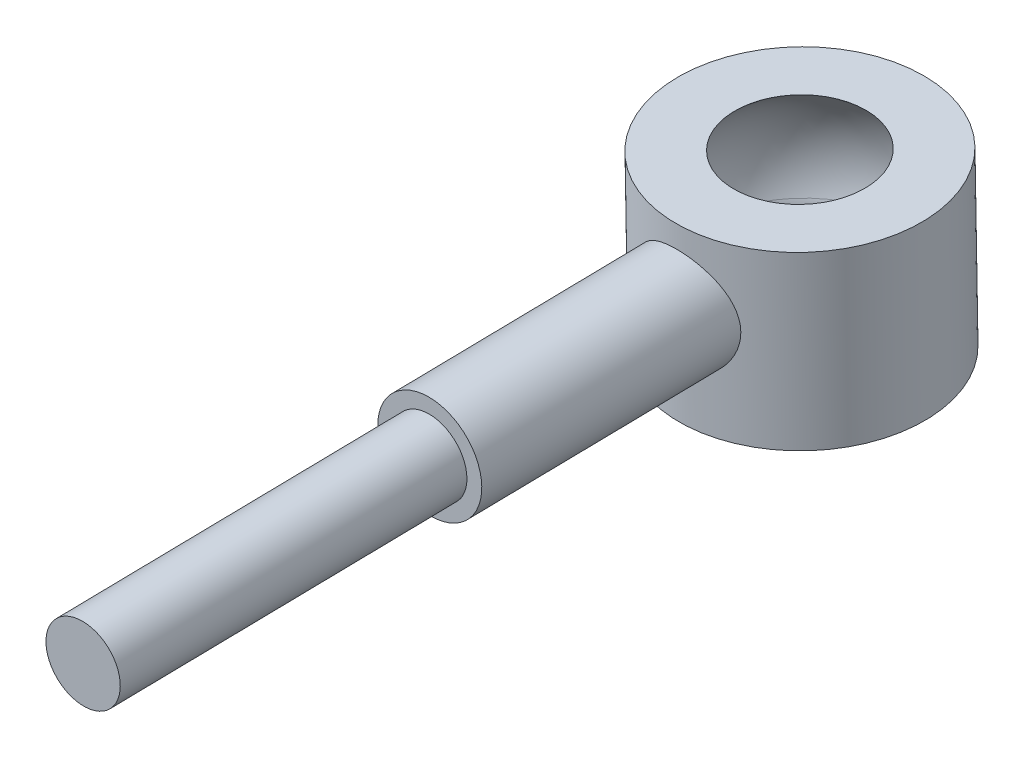
ISO-10303-21;
HEADER;
FILE_DESCRIPTION(('STEP AP214'),'2;1');
FILE_NAME('part.step','',(''),(''),'','','');
FILE_SCHEMA(('AUTOMOTIVE_DESIGN { 1 0 10303 214 1 1 1 1 }'));
ENDSEC;
DATA;
#1=APPLICATION_CONTEXT('core data for automotive mechanical design processes');
#2=APPLICATION_PROTOCOL_DEFINITION('international standard','automotive_design',2000,#1);
#3=PRODUCT_CONTEXT('',#1,'mechanical');
#4=PRODUCT('Part','Part','',(#3));
#5=PRODUCT_RELATED_PRODUCT_CATEGORY('part','',(#4));
#6=PRODUCT_DEFINITION_FORMATION('','',#4);
#7=PRODUCT_DEFINITION_CONTEXT('part definition',#1,'design');
#8=PRODUCT_DEFINITION('design','',#6,#7);
#9=PRODUCT_DEFINITION_SHAPE('','',#8);
#10=(LENGTH_UNIT() NAMED_UNIT(*) SI_UNIT(.MILLI.,.METRE.));
#11=(NAMED_UNIT(*) PLANE_ANGLE_UNIT() SI_UNIT($,.RADIAN.));
#12=(NAMED_UNIT(*) SI_UNIT($,.STERADIAN.) SOLID_ANGLE_UNIT());
#13=UNCERTAINTY_MEASURE_WITH_UNIT(LENGTH_MEASURE(1.E-05),#10,'distance_accuracy_value','');
#14=(GEOMETRIC_REPRESENTATION_CONTEXT(3) GLOBAL_UNCERTAINTY_ASSIGNED_CONTEXT((#13)) GLOBAL_UNIT_ASSIGNED_CONTEXT((#10,
#11,#12)) REPRESENTATION_CONTEXT('',''));
#15=CARTESIAN_POINT('',(0.,0.,0.));
#16=DIRECTION('',(0.,0.,1.));
#17=DIRECTION('',(1.,0.,0.));
#18=AXIS2_PLACEMENT_3D('',#15,#16,#17);
#19=CARTESIAN_POINT('',(111.05852848142,5.49576172046374,-579.851978097171));
#20=DIRECTION('',(0.,-0.0174524064372832,0.999847695156391));
#21=DIRECTION('',(0.,0.999847695156391,0.0174524064372832));
#22=AXIS2_PLACEMENT_3D('',#19,#20,#21);
#23=CYLINDRICAL_SURFACE('',#22,10.5);
#24=CARTESIAN_POINT('',(111.05852848142,4.44861733422675,-519.861116387788));
#25=DIRECTION('',(0.,-0.0174524064372832,0.999847695156391));
#26=DIRECTION('',(0.,-0.999847695156391,-0.0174524064372832));
#27=AXIS2_PLACEMENT_3D('',#24,#25,#26);
#28=CIRCLE('',#27,10.5);
#29=CARTESIAN_POINT('',(111.05852848142,-6.04978346491538,-520.044366655379));
#30=VERTEX_POINT('',#29);
#31=EDGE_CURVE('E99',#30,#30,#28,.T.);
#32=ORIENTED_EDGE('',*,*,#31,.F.);
#33=EDGE_LOOP('',(#32));
#34=FACE_BOUND('',#33,.T.);
#35=CARTESIAN_POINT('',(111.05852848142,15.819638455233,-569.670250878016));
#36=CARTESIAN_POINT('',(110.777384349737,15.8196365393947,-569.670252477631));
#37=CARTESIAN_POINT('',(110.496147895162,15.808416209979,-569.675202925125));
#38=CARTESIAN_POINT('',(109.935679892425,15.7636386044109,-569.694884567285));
#39=CARTESIAN_POINT('',(109.656449709096,15.7300673539752,-569.709621880898));
#40=CARTESIAN_POINT('',(109.101567841366,15.6408351314711,-569.748540625365));
#41=CARTESIAN_POINT('',(108.825925410942,15.5851255885031,-569.772742820081));
#42=CARTESIAN_POINT('',(108.280810988346,15.4521811234063,-569.829971182351));
#43=CARTESIAN_POINT('',(108.011339426624,15.3749447045813,-569.862997963445));
#44=CARTESIAN_POINT('',(107.481317797542,15.1999909110264,-569.936918568452));
#45=CARTESIAN_POINT('',(107.220739724531,15.1023464092781,-569.977784359336));
#46=CARTESIAN_POINT('',(106.709119534087,14.8872600801992,-570.06647167427));
#47=CARTESIAN_POINT('',(106.458077751761,14.7698175579475,-570.114293442471));
#48=CARTESIAN_POINT('',(105.967093157236,14.5161143648105,-570.215750212554));
#49=CARTESIAN_POINT('',(105.727144250639,14.3798641948331,-570.269381966965));
#50=CARTESIAN_POINT('',(105.259436193008,14.0894476275166,-570.381258528314));
#51=CARTESIAN_POINT('',(105.03168155133,13.935274668378,-570.439505022277));
#52=CARTESIAN_POINT('',(104.348132105347,13.4323111898447,-570.624759594036));
#53=CARTESIAN_POINT('',(103.914615371524,13.0546903859141,-570.757461665963));
#54=CARTESIAN_POINT('',(103.115319100255,12.233722432439,-571.024776005919));
#55=CARTESIAN_POINT('',(102.749575760099,11.7903403865673,-571.159389253611));
#56=CARTESIAN_POINT('',(102.250190824283,11.0715158647503,-571.355791524534));
#57=CARTESIAN_POINT('',(102.088741715503,10.8161642882862,-571.421838155697));
#58=CARTESIAN_POINT('',(101.788180951947,10.291471329918,-571.548776402237));
#59=CARTESIAN_POINT('',(101.649060048134,10.0221358021105,-571.609670147132));
#60=CARTESIAN_POINT('',(101.394375039658,9.47116810136559,-571.724405622228));
#61=CARTESIAN_POINT('',(101.278806646677,9.1895381782866,-571.778248635551));
#62=CARTESIAN_POINT('',(101.072361113972,8.6158643908961,-571.877123745303));
#63=CARTESIAN_POINT('',(100.981482102413,8.32382131796232,-571.922156509612));
#64=CARTESIAN_POINT('',(100.829261976067,7.74597564118746,-571.999919027966));
#65=CARTESIAN_POINT('',(100.766698300305,7.46056133533449,-572.033140982626));
#66=CARTESIAN_POINT('',(100.665589241805,6.88449236160432,-572.089146933261));
#67=CARTESIAN_POINT('',(100.627043106271,6.59383785826754,-572.111931256384));
#68=CARTESIAN_POINT('',(100.574464682201,6.00980316186041,-572.14634363168));
#69=CARTESIAN_POINT('',(100.560420517147,5.7164243586726,-572.157977087633));
#70=CARTESIAN_POINT('',(100.556994174233,5.12930009420325,-572.16981101239));
#71=CARTESIAN_POINT('',(100.567610666605,4.83555465354542,-572.170012097643));
#72=CARTESIAN_POINT('',(100.611563419944,4.27317901768693,-572.159560340829));
#73=CARTESIAN_POINT('',(100.643052357713,4.00438603169379,-572.149757582794));
#74=CARTESIAN_POINT('',(100.726523779092,3.47040472182273,-572.121003961527));
#75=CARTESIAN_POINT('',(100.7785133018,3.20521766846911,-572.102049955612));
#76=CARTESIAN_POINT('',(100.902445735054,2.6803805620533,-572.055701614354));
#77=CARTESIAN_POINT('',(100.97438392187,2.42072921382321,-572.02830927699));
#78=CARTESIAN_POINT('',(101.137584215436,1.90840064050501,-571.965993394065));
#79=CARTESIAN_POINT('',(101.228853900353,1.65572619447879,-571.931066894928));
#80=CARTESIAN_POINT('',(101.432053722828,1.15367226509898,-571.853971863579));
#81=CARTESIAN_POINT('',(101.544377121135,0.904473108980535,-571.811666774409));
#82=CARTESIAN_POINT('',(101.787551394306,0.416190425280532,-571.721591428782));
#83=CARTESIAN_POINT('',(101.918410279259,0.177111329394334,-571.673818811262));
#84=CARTESIAN_POINT('',(102.197753230039,-0.289642505858961,-571.57415314088));
#85=CARTESIAN_POINT('',(102.346239087278,-0.517316082745503,-571.522259669399));
#86=CARTESIAN_POINT('',(102.659945805205,-0.960150092803522,-571.415717524804));
#87=CARTESIAN_POINT('',(102.825167619496,-1.17530981184291,-571.361068694782));
#88=CARTESIAN_POINT('',(103.186408660403,-1.61007893108151,-571.2456021489));
#89=CARTESIAN_POINT('',(103.383855095365,-1.82847114620613,-571.184658940952));
#90=CARTESIAN_POINT('',(103.796233704648,-2.24795223053627,-571.062873569444));
#91=CARTESIAN_POINT('',(104.011160363289,-2.44904651700627,-571.002031380144));
#92=CARTESIAN_POINT('',(104.457506554177,-2.83290330824388,-570.882063530896));
#93=CARTESIAN_POINT('',(104.688936392288,-3.01565418342086,-570.822938976581));
#94=CARTESIAN_POINT('',(105.16678357006,-3.36137142207475,-570.70808472573));
#95=CARTESIAN_POINT('',(105.413194839828,-3.52434571912127,-570.652353672359));
#96=CARTESIAN_POINT('',(105.925780177558,-3.83304289555376,-570.544504310611));
#97=CARTESIAN_POINT('',(106.192287428552,-3.97825530224047,-570.492505452701));
#98=CARTESIAN_POINT('',(106.737901533604,-4.24543133981205,-570.395167972121));
#99=CARTESIAN_POINT('',(107.017008718549,-4.36739435970466,-570.349829524494));
#100=CARTESIAN_POINT('',(107.585720387102,-4.58679374757015,-570.267196364429));
#101=CARTESIAN_POINT('',(107.875320043576,-4.68424123420838,-570.229898006628));
#102=CARTESIAN_POINT('',(108.462902201433,-4.85359224092613,-570.164475965236));
#103=CARTESIAN_POINT('',(108.760884052503,-4.92549773675805,-570.136351572026));
#104=CARTESIAN_POINT('',(109.343476669837,-5.03914282494592,-570.091647519976));
#105=CARTESIAN_POINT('',(109.627720932085,-5.08251996401225,-570.07444364465));
#106=CARTESIAN_POINT('',(110.199226312512,-5.14566463562059,-570.04933892356));
#107=CARTESIAN_POINT('',(110.486487301586,-5.16543317442002,-570.041437681294));
#108=CARTESIAN_POINT('',(111.061689816605,-5.1811310494065,-570.035166498257));
#109=CARTESIAN_POINT('',(111.349631151877,-5.17706641881796,-570.036794145304));
#110=CARTESIAN_POINT('',(111.923977596743,-5.14515915285485,-570.049528308884));
#111=CARTESIAN_POINT('',(112.210382741359,-5.11731706191292,-570.060634608384));
#112=CARTESIAN_POINT('',(112.764980148781,-5.040185975297,-570.0912090302));
#113=CARTESIAN_POINT('',(113.033359678789,-4.99205573591392,-570.110224725767));
#114=CARTESIAN_POINT('',(113.564889644915,-4.87514103368528,-570.156021601529));
#115=CARTESIAN_POINT('',(113.82804030156,-4.80635744387687,-570.18280245348));
#116=CARTESIAN_POINT('',(114.347404999296,-4.64878685148949,-570.243459072322));
#117=CARTESIAN_POINT('',(114.603619728377,-4.56000184109788,-570.277334132588));
#118=CARTESIAN_POINT('',(115.107696972177,-4.36316095461556,-570.351368893551));
#119=CARTESIAN_POINT('',(115.355556247531,-4.25509770432962,-570.391530998407));
#120=CARTESIAN_POINT('',(115.848926128619,-4.01696106432639,-570.478499686634));
#121=CARTESIAN_POINT('',(116.094130585388,-3.88631342704225,-570.525472507692));
#122=CARTESIAN_POINT('',(116.572800926104,-3.60644718375888,-570.623922830501));
#123=CARTESIAN_POINT('',(116.80626243303,-3.457221724106,-570.675401992621));
#124=CARTESIAN_POINT('',(117.487125348277,-2.98321019913148,-570.834744604722));
#125=CARTESIAN_POINT('',(117.915287005744,-2.63195211724108,-570.94756505914));
#126=CARTESIAN_POINT('',(118.740122089259,-1.83937041623607,-571.183874622819));
#127=CARTESIAN_POINT('',(119.132256419976,-1.39336097502616,-571.307543851684));
#128=CARTESIAN_POINT('',(119.66116166298,-0.678842741469794,-571.484438372633));
#129=CARTESIAN_POINT('',(119.827672411128,-0.432905794994329,-571.542004028231));
#130=CARTESIAN_POINT('',(120.139810136663,0.0728208531355638,-571.652494038143));
#131=CARTESIAN_POINT('',(120.285445979772,0.332604609255004,-571.705420359083));
#132=CARTESIAN_POINT('',(120.556833861682,0.868717389430219,-571.805676412735));
#133=CARTESIAN_POINT('',(120.682235129948,1.14524306134622,-571.852904432639));
#134=CARTESIAN_POINT('',(120.909104198637,1.70907287206758,-571.939015383821));
#135=CARTESIAN_POINT('',(121.010583034249,1.99637197002477,-571.977902162083));
#136=CARTESIAN_POINT('',(121.188540273797,2.57961920950921,-572.04577961608));
#137=CARTESIAN_POINT('',(121.265030279746,2.87556326755631,-572.074774884599));
#138=CARTESIAN_POINT('',(121.392138668568,3.47381939334161,-572.121612167195));
#139=CARTESIAN_POINT('',(121.442759540591,3.77613084548812,-572.139455254381));
#140=CARTESIAN_POINT('',(121.514551904748,4.36073719665368,-572.162181355768));
#141=CARTESIAN_POINT('',(121.537712348914,4.64275427784958,-572.167966640614));
#142=CARTESIAN_POINT('',(121.561205294189,5.20775135053283,-572.16896693741));
#143=CARTESIAN_POINT('',(121.561539033097,5.49073128897618,-572.164182522528));
#144=CARTESIAN_POINT('',(121.539377447367,6.05537345465072,-572.144078544376));
#145=CARTESIAN_POINT('',(121.516885404927,6.33703586548391,-572.128760495877));
#146=CARTESIAN_POINT('',(121.449345936846,6.89689525798726,-572.087998440784));
#147=CARTESIAN_POINT('',(121.404298710067,7.17509227018852,-572.062554523468));
#148=CARTESIAN_POINT('',(121.294877842913,7.71262728736207,-572.003749034591));
#149=CARTESIAN_POINT('',(121.231544142641,7.97222670994893,-571.970829850114));
#150=CARTESIAN_POINT('',(121.085494982124,8.48489990464937,-571.897369442944));
#151=CARTESIAN_POINT('',(121.002772841161,8.73797139397744,-571.856825593957));
#152=CARTESIAN_POINT('',(120.818671789452,9.23604843362918,-571.769179642817));
#153=CARTESIAN_POINT('',(120.717292992691,9.48105403322118,-571.722077580731));
#154=CARTESIAN_POINT('',(120.49664787988,9.96174954288247,-571.622487748544));
#155=CARTESIAN_POINT('',(120.377379919245,10.1974385939447,-571.569999483419));
#156=CARTESIAN_POINT('',(120.114012809082,10.672340761106,-571.457578214523));
#157=CARTESIAN_POINT('',(119.968846571368,10.910901144559,-571.397386782754));
#158=CARTESIAN_POINT('',(119.660274269871,11.3750603890787,-571.273884365128));
#159=CARTESIAN_POINT('',(119.49686762551,11.6006588372293,-571.21057328001));
#160=CARTESIAN_POINT('',(119.152732619224,12.0378651030974,-571.082353118843));
#161=CARTESIAN_POINT('',(118.971998902676,12.249468561552,-571.017443553447));
#162=CARTESIAN_POINT('',(118.594233859548,12.6575677584967,-570.887572918036));
#163=CARTESIAN_POINT('',(118.397202383978,12.8540633588428,-570.822611847554));
#164=CARTESIAN_POINT('',(117.972512854295,13.2450472315176,-570.689321863475));
#165=CARTESIAN_POINT('',(117.743666305649,13.4382852578203,-570.621104635988));
#166=CARTESIAN_POINT('',(117.269699739883,13.8048212654515,-570.488158955936));
#167=CARTESIAN_POINT('',(117.024585074349,13.978125753377,-570.423429368642));
#168=CARTESIAN_POINT('',(116.519272135472,14.3037333522459,-570.29910483007));
#169=CARTESIAN_POINT('',(116.259063077885,14.4560211786099,-570.239513627429));
#170=CARTESIAN_POINT('',(115.725370224456,14.738183620319,-570.127137155599));
#171=CARTESIAN_POINT('',(115.451887510082,14.86806005771,-570.074351333221));
#172=CARTESIAN_POINT('',(114.897921126067,15.1023329346605,-569.977823882189));
#173=CARTESIAN_POINT('',(114.617617643396,15.2071013083176,-569.933951921152));
#174=CARTESIAN_POINT('',(114.04795391611,15.3927199606479,-569.855444538741));
#175=CARTESIAN_POINT('',(113.758594604949,15.4735726955707,-569.820808168864));
#176=CARTESIAN_POINT('',(113.173832673591,15.6103009033203,-569.761841680954));
#177=CARTESIAN_POINT('',(112.878448228791,15.6662424144782,-569.737484322895));
#178=CARTESIAN_POINT('',(112.283448854433,15.7527760070783,-569.699672819109));
#179=CARTESIAN_POINT('',(111.983837173178,15.7833865780944,-569.686210720866));
#180=CARTESIAN_POINT('',(111.579420968541,15.8073214320516,-569.675676558987));
#181=CARTESIAN_POINT('',(111.475310810841,15.8119390193942,-569.673643056328));
#182=CARTESIAN_POINT('',(111.266980826135,15.8180978918529,-569.670929916799));
#183=CARTESIAN_POINT('',(111.162760998722,15.8196391655187,-569.670250284968));
#184=CARTESIAN_POINT('',(111.05852848142,15.819638455233,-569.670250878016));
#185=B_SPLINE_CURVE_WITH_KNOTS('',3,(#35,#36,#37,#38,#39,#40,#41,#42,#43,#44,#45,#46,#47,#48,
#49,#50,#51,#52,#53,#54,#55,#56,#57,#58,#59,#60,#61,#62,#63,#64,#65,#66,#67,#68,#69,#70,#71,#72,
#73,#74,#75,#76,#77,#78,#79,#80,#81,#82,#83,#84,#85,#86,#87,#88,#89,#90,#91,#92,#93,#94,#95,#96,
#97,#98,#99,#100,#101,#102,#103,#104,#105,#106,#107,#108,#109,#110,#111,#112,#113,#114,#115,
#116,#117,#118,#119,#120,#121,#122,#123,#124,#125,#126,#127,#128,#129,#130,#131,#132,#133,#134,
#135,#136,#137,#138,#139,#140,#141,#142,#143,#144,#145,#146,#147,#148,#149,#150,#151,#152,#153,
#154,#155,#156,#157,#158,#159,#160,#161,#162,#163,#164,#165,#166,#167,#168,#169,#170,#171,#172,
#173,#174,#175,#176,#177,#178,#179,#180,#181,#182,#183,#184),.UNSPECIFIED.,.T.,.F.,(4,2,2,2,2,2,
2,2,2,2,2,2,2,2,2,2,2,2,2,2,2,2,2,2,2,2,2,2,2,2,2,2,2,2,2,2,2,2,2,2,2,2,2,2,2,2,2,2,2,2,2,2,2,2,
2,2,2,2,2,2,2,2,2,2,2,2,2,2,2,2,2,2,2,2,4),(0.,0.8433265055232,1.68718077293978,
2.53289675001751,3.37867154175473,4.22147632567156,5.0643106986495,5.90667637958899,
6.74935144018944,8.51131562680024,10.2742181705943,11.2009676983338,12.1273323412016,
13.0535281654071,13.9796537500607,14.8606948247013,15.7417082829635,16.6222945803962,
17.5028333954088,18.3143076913616,19.1260608588018,19.9376219716424,20.7495018164204,
21.5784138273097,22.4076851507217,23.2370408244028,24.0664437808277,24.9673924783205,
25.8680579868216,26.7692909511248,27.6701611732707,28.5927443926149,29.5153518540407,
30.4375401227828,31.3596570418529,32.2226945103705,33.0856951927658,33.9484774211287,
34.8112398948916,35.6302663401232,36.449258169186,37.268168460822,38.0873926713322,
38.9317875729052,39.7764949134297,41.4649675157692,43.2759567361591,44.1826680167975,
45.0889930623113,46.0096472926842,46.9298759994328,47.8496768459012,48.7693891716876,
49.6173691511976,50.4653031481681,51.3131152350709,52.1609198472299,52.9677259435086,
53.774810452541,54.5818900307974,55.3890438508782,56.2451355516531,57.1012545090202,
57.9576388927953,58.8140311062939,59.7345004665864,60.6546685144779,61.5755022765321,
62.4962611394978,63.4023956247732,64.3084370133941,65.2120620239753,66.1150268768553,
66.4276840071182,66.7403423011086),.UNSPECIFIED.);
#186=CARTESIAN_POINT('',(111.05852848142,15.819638455233,-569.670250878016));
#187=VERTEX_POINT('',#186);
#188=EDGE_CURVE('E48',#187,#187,#185,.T.);
#189=ORIENTED_EDGE('',*,*,#188,.T.);
#190=EDGE_LOOP('',(#189));
#191=FACE_BOUND('',#190,.T.);
#192=ADVANCED_FACE('F40',(#34,#191),#23,.T.);
#193=CARTESIAN_POINT('',(111.05852848142,4.97218952734524,-549.856547242479));
#194=DIRECTION('',(0.,-0.0174524064372832,0.999847695156391));
#195=DIRECTION('',(0.,0.999847695156391,0.0174524064372832));
#196=AXIS2_PLACEMENT_3D('',#193,#194,#195);
#197=CYLINDRICAL_SURFACE('',#196,7.50000000000001);
#198=CARTESIAN_POINT('',(111.05852848142,3.22694888361693,-449.87177772684));
#199=DIRECTION('',(0.,0.0174524064372832,-0.999847695156391));
#200=DIRECTION('',(0.,0.999847695156391,0.0174524064372832));
#201=AXIS2_PLACEMENT_3D('',#198,#199,#200);
#202=CIRCLE('',#201,7.50000000000001);
#203=CARTESIAN_POINT('',(111.05852848142,10.7258065972899,-449.740884678561));
#204=VERTEX_POINT('',#203);
#205=EDGE_CURVE('E57',#204,#204,#202,.T.);
#206=ORIENTED_EDGE('',*,*,#205,.T.);
#207=EDGE_LOOP('',(#206));
#208=FACE_BOUND('',#207,.T.);
#209=CARTESIAN_POINT('',(111.05852848142,4.44861733422675,-519.861116387788));
#210=DIRECTION('',(0.,-0.0174524064372832,0.999847695156391));
#211=DIRECTION('',(0.,-0.999847695156391,-0.0174524064372832));
#212=AXIS2_PLACEMENT_3D('',#209,#210,#211);
#213=CIRCLE('',#212,7.50000000000001);
#214=CARTESIAN_POINT('',(111.05852848142,-3.0502403794462,-519.992009436068));
#215=VERTEX_POINT('',#214);
#216=EDGE_CURVE('E97',#215,#215,#213,.T.);
#217=ORIENTED_EDGE('',*,*,#216,.T.);
#218=EDGE_LOOP('',(#217));
#219=FACE_BOUND('',#218,.T.);
#220=ADVANCED_FACE('F74',(#208,#219),#197,.T.);
#221=CARTESIAN_POINT('',(111.05852848142,3.22694888361693,-449.87177772684));
#222=DIRECTION('',(0.,-0.0174524064372832,0.999847695156391));
#223=DIRECTION('',(0.,0.999847695156391,0.0174524064372832));
#224=AXIS2_PLACEMENT_3D('',#221,#222,#223);
#225=PLANE('',#224);
#226=ORIENTED_EDGE('',*,*,#205,.F.);
#227=EDGE_LOOP('',(#226));
#228=FACE_BOUND('',#227,.T.);
#229=ADVANCED_FACE('F83',(#228),#225,.T.);
#230=CARTESIAN_POINT('',(111.05852848142,4.44861733422675,-519.861116387788));
#231=DIRECTION('',(0.,0.0174524064372832,-0.999847695156391));
#232=DIRECTION('',(0.,-0.999847695156391,-0.0174524064372832));
#233=AXIS2_PLACEMENT_3D('',#230,#231,#232);
#234=PLANE('',#233);
#235=ORIENTED_EDGE('',*,*,#216,.F.);
#236=EDGE_LOOP('',(#235));
#237=FACE_BOUND('',#236,.T.);
#238=ORIENTED_EDGE('',*,*,#31,.T.);
#239=EDGE_LOOP('',(#238));
#240=FACE_BOUND('',#239,.T.);
#241=ADVANCED_FACE('F85',(#237,#240),#234,.F.);
#242=CARTESIAN_POINT('',(111.05852848142,20.7552632443689,-594.587907427958));
#243=DIRECTION('',(0.,0.999847695156391,0.0174524064372834));
#244=DIRECTION('',(0.,0.0174524064372834,-0.999847695156391));
#245=AXIS2_PLACEMENT_3D('',#242,#243,#244);
#246=PLANE('',#245);
#247=CARTESIAN_POINT('',(111.05852848142,20.7552632443689,-594.587907427958));
#248=DIRECTION('',(0.,-0.999847695156391,-0.0174524064372834));
#249=DIRECTION('',(0.,0.0174524064372834,-0.999847695156391));
#250=AXIS2_PLACEMENT_3D('',#247,#248,#249);
#251=CIRCLE('',#250,13.3322916259734);
#252=CARTESIAN_POINT('',(111.05852848142,20.9879438165658,-607.918168481341));
#253=VERTEX_POINT('',#252);
#254=EDGE_CURVE('E65',#253,#253,#251,.T.);
#255=ORIENTED_EDGE('',*,*,#254,.T.);
#256=EDGE_LOOP('',(#255));
#257=FACE_BOUND('',#256,.T.);
#258=CARTESIAN_POINT('',(111.05852848142,20.7552632443689,-594.587907427958));
#259=DIRECTION('',(0.,-0.999847695156391,-0.0174524064372834));
#260=DIRECTION('',(0.,0.0174524064372834,-0.999847695156391));
#261=AXIS2_PLACEMENT_3D('',#258,#259,#260);
#262=CIRCLE('',#261,25.);
#263=CARTESIAN_POINT('',(111.05852848142,21.191573405301,-619.584099806868));
#264=VERTEX_POINT('',#263);
#265=EDGE_CURVE('E105',#264,#264,#262,.T.);
#266=ORIENTED_EDGE('',*,*,#265,.F.);
#267=EDGE_LOOP('',(#266));
#268=FACE_BOUND('',#267,.T.);
#269=ADVANCED_FACE('F120',(#257,#268),#246,.T.);
#270=CARTESIAN_POINT('',(111.05852848142,20.7552632443689,-594.587907427958));
#271=DIRECTION('',(0.,-0.999847695156391,-0.0174524064372834));
#272=DIRECTION('',(0.,-0.0174524064372834,0.999847695156391));
#273=AXIS2_PLACEMENT_3D('',#270,#271,#272);
#274=CYLINDRICAL_SURFACE('',#273,25.);
#275=CARTESIAN_POINT('',(111.05852848142,-14.2394060861048,-595.198741653263));
#276=DIRECTION('',(0.,-0.999847695156391,-0.0174524064372834));
#277=DIRECTION('',(0.,0.0174524064372834,-0.999847695156391));
#278=AXIS2_PLACEMENT_3D('',#275,#276,#277);
#279=CIRCLE('',#278,25.);
#280=CARTESIAN_POINT('',(111.05852848142,-13.8030959251727,-620.194934032173));
#281=VERTEX_POINT('',#280);
#282=EDGE_CURVE('E113',#281,#281,#279,.T.);
#283=ORIENTED_EDGE('',*,*,#282,.F.);
#284=EDGE_LOOP('',(#283));
#285=FACE_BOUND('',#284,.T.);
#286=ORIENTED_EDGE('',*,*,#265,.T.);
#287=EDGE_LOOP('',(#286));
#288=FACE_BOUND('',#287,.T.);
#289=ORIENTED_EDGE('',*,*,#188,.F.);
#290=EDGE_LOOP('',(#289));
#291=FACE_BOUND('',#290,.T.);
#292=ADVANCED_FACE('F125',(#285,#288,#291),#274,.T.);
#293=CARTESIAN_POINT('',(111.05852848142,3.25792857913204,-594.89332454061));
#294=DIRECTION('',(1.,0.,0.));
#295=DIRECTION('',(0.,0.0174524064372834,-0.999847695156391));
#296=AXIS2_PLACEMENT_3D('',#293,#294,#295);
#297=SPHERICAL_SURFACE('',#296,22.);
#298=CARTESIAN_POINT('',(111.05852848142,3.25792857913204,-594.89332454061));
#299=DIRECTION('',(0.,-0.999847695156391,-0.0174524064372884));
#300=DIRECTION('',(0.,0.0174524064372884,-0.999847695156391));
#301=AXIS2_PLACEMENT_3D('',#298,#299,#300);
#302=SPHERICAL_SURFACE('',#301,22.);
#303=CARTESIAN_POINT('',(111.05852848142,-3.09369877053005,-595.004192608399));
#304=DIRECTION('',(0.,-0.999847695156391,-0.0174524064372884));
#305=DIRECTION('',(0.,0.0174524064372884,-0.999847695156391));
#306=AXIS2_PLACEMENT_3D('',#303,#304,#305);
#307=CIRCLE('',#306,21.0628710835577);
#308=CARTESIAN_POINT('',(111.05852848142,-2.72610098364359,-616.06385571467));
#309=VERTEX_POINT('',#308);
#310=EDGE_CURVE('E10',#309,#309,#307,.F.);
#311=ORIENTED_EDGE('',*,*,#310,.F.);
#312=EDGE_LOOP('',(#311));
#313=FACE_BOUND('',#312,.T.);
#314=ORIENTED_EDGE('',*,*,#254,.F.);
#315=EDGE_LOOP('',(#314));
#316=FACE_BOUND('',#315,.T.);
#317=ADVANCED_FACE('F123',(#313,#316),#302,.F.);
#318=CARTESIAN_POINT('',(111.05852848142,-5.98080211128557,-595.054587184666));
#319=DIRECTION('',(0.,0.999847695156391,0.0174524064372884));
#320=DIRECTION('',(0.,0.0174524064372884,-0.999847695156391));
#321=AXIS2_PLACEMENT_3D('',#318,#319,#320);
#322=TOROIDAL_SURFACE('',#321,30.6369033942657,10.);
#323=ORIENTED_EDGE('',*,*,#310,.T.);
#324=EDGE_LOOP('',(#323));
#325=FACE_BOUND('',#324,.T.);
#326=ORIENTED_EDGE('',*,*,#282,.T.);
#327=EDGE_LOOP('',(#326));
#328=FACE_BOUND('',#327,.T.);
#329=ADVANCED_FACE('F42',(#325,#328),#322,.T.);
#330=CLOSED_SHELL('',(#192,#220,#229,#241,#269,#292,#317,#329));
#331=CARTESIAN_POINT('',(111.05852848142,4.97218952734524,-549.856547242479));
#332=DIRECTION('',(0.,-0.0174524064372832,0.999847695156391));
#333=DIRECTION('',(0.,0.999847695156391,0.0174524064372832));
#334=AXIS2_PLACEMENT_3D('',#331,#332,#333);
#335=PLANE('',#334);
#336=CARTESIAN_POINT('',(111.05852848142,4.97218952734524,-549.856547242479));
#337=DIRECTION('',(0.,0.0174524064372832,-0.999847695156391));
#338=DIRECTION('',(0.,0.999847695156391,0.0174524064372832));
#339=AXIS2_PLACEMENT_3D('',#336,#337,#338);
#340=CIRCLE('',#339,7.50000000000001);
#341=CARTESIAN_POINT('',(111.05852848142,12.4710472410182,-549.7256541942));
#342=VERTEX_POINT('',#341);
#343=EDGE_CURVE('E52',#342,#342,#340,.T.);
#344=ORIENTED_EDGE('',*,*,#343,.T.);
#345=EDGE_LOOP('',(#344));
#346=FACE_BOUND('',#345,.T.);
#347=ADVANCED_FACE('F78',(#346),#335,.F.);
#348=CARTESIAN_POINT('',(111.05852848142,5.49576172046374,-579.851978097171));
#349=DIRECTION('',(0.,-0.0174524064372832,0.999847695156391));
#350=DIRECTION('',(0.,0.999847695156391,0.0174524064372832));
#351=AXIS2_PLACEMENT_3D('',#348,#349,#350);
#352=CYLINDRICAL_SURFACE('',#351,7.50000000000001);
#353=ORIENTED_EDGE('',*,*,#343,.F.);
#354=EDGE_LOOP('',(#353));
#355=FACE_BOUND('',#354,.T.);
#356=CARTESIAN_POINT('',(111.05852848142,12.8200953697639,-569.722608097328));
#357=CARTESIAN_POINT('',(110.852799112641,12.8200949631241,-569.722608365756));
#358=CARTESIAN_POINT('',(110.647062649885,12.8116691605158,-569.72530109838));
#359=CARTESIAN_POINT('',(110.237100771264,12.7780412174171,-569.736001126071));
#360=CARTESIAN_POINT('',(110.032875424772,12.7528383114893,-569.744008663622));
#361=CARTESIAN_POINT('',(109.627411373326,12.6858789764282,-569.765127132996));
#362=CARTESIAN_POINT('',(109.426172874006,12.644121413003,-569.778238414518));
#363=CARTESIAN_POINT('',(109.028055206482,12.5443995285538,-569.809225806292));
#364=CARTESIAN_POINT('',(108.831177679976,12.4864292124517,-569.827103678999));
#365=CARTESIAN_POINT('',(108.443562392439,12.3548856497332,-569.867125478586));
#366=CARTESIAN_POINT('',(108.25281377329,12.2813419743399,-569.889261313108));
#367=CARTESIAN_POINT('',(107.878296953807,12.1191667010074,-569.937257097955));
#368=CARTESIAN_POINT('',(107.694531408988,12.0305294321539,-569.963118447454));
#369=CARTESIAN_POINT('',(107.155631644865,11.7429824890843,-570.045329590159));
#370=CARTESIAN_POINT('',(106.812535988324,11.5223153797931,-570.106345243788));
#371=CARTESIAN_POINT('',(106.159072198818,11.0225984186037,-570.23653418484));
#372=CARTESIAN_POINT('',(105.849779712993,10.7421864771888,-570.305877612377));
#373=CARTESIAN_POINT('',(105.424139808255,10.2862188387582,-570.409699303123));
#374=CARTESIAN_POINT('',(105.288572728683,10.1282319391241,-570.44429511718));
#375=CARTESIAN_POINT('',(105.031031271626,9.80138455393873,-570.512543311881));
#376=CARTESIAN_POINT('',(104.909051857857,9.63252813405092,-570.546196038597));
#377=CARTESIAN_POINT('',(104.676871242267,9.28097627215632,-570.612435478645));
#378=CARTESIAN_POINT('',(104.567004255116,9.09805228165571,-570.644980053395));
#379=CARTESIAN_POINT('',(104.363207988186,8.72315447629437,-570.707253871661));
#380=CARTESIAN_POINT('',(104.269272870517,8.53118400941258,-570.736984144646));
#381=CARTESIAN_POINT('',(104.098057263527,8.13943728669174,-570.792800670045));
#382=CARTESIAN_POINT('',(104.020776868781,7.93966098653415,-570.818886901764));
#383=CARTESIAN_POINT('',(103.88354845591,7.53373058904945,-570.866664516224));
#384=CARTESIAN_POINT('',(103.823599820375,7.3275767192002,-570.888356055507));
#385=CARTESIAN_POINT('',(103.723019846538,6.91627037189771,-570.926182996021));
#386=CARTESIAN_POINT('',(103.681894885417,6.71125130723035,-570.942456891744));
#387=CARTESIAN_POINT('',(103.616928883555,6.29815384906387,-570.969829710679));
#388=CARTESIAN_POINT('',(103.593087228459,6.09007556457655,-570.980928817832));
#389=CARTESIAN_POINT('',(103.562919114695,5.67247658227493,-570.997679800988));
#390=CARTESIAN_POINT('',(103.556589134815,5.46295618293352,-571.003332771941));
#391=CARTESIAN_POINT('',(103.561496720139,5.04404744700603,-571.009101324266));
#392=CARTESIAN_POINT('',(103.572733906451,4.83465910766909,-571.009217025066));
#393=CARTESIAN_POINT('',(103.611937838976,4.42520761167757,-571.004095069174));
#394=CARTESIAN_POINT('',(103.63928200551,4.22508202392784,-570.999051736025));
#395=CARTESIAN_POINT('',(103.709948688136,3.82778727409057,-570.984136770228));
#396=CARTESIAN_POINT('',(103.753276533883,3.63061912098755,-570.974263526718));
#397=CARTESIAN_POINT('',(103.855524172906,3.24071438478262,-570.950062307091));
#398=CARTESIAN_POINT('',(103.914439424864,3.04797652868165,-570.93573562825));
#399=CARTESIAN_POINT('',(104.047414984734,2.66806792345261,-570.903109355816));
#400=CARTESIAN_POINT('',(104.121481012946,2.48089930770068,-570.88480826149));
#401=CARTESIAN_POINT('',(104.285265462051,2.11093567316943,-570.844554367159));
#402=CARTESIAN_POINT('',(104.375179212897,1.92823210564509,-570.822556177841));
#403=CARTESIAN_POINT('',(104.56934202454,1.57090694369262,-570.775759727546));
#404=CARTESIAN_POINT('',(104.673596000499,1.39628814789647,-570.750960507028));
#405=CARTESIAN_POINT('',(104.895708582873,1.05624534459991,-570.699304395502));
#406=CARTESIAN_POINT('',(105.01356761304,0.890821623733403,-570.67244744041));
#407=CARTESIAN_POINT('',(105.262132675912,0.570151609673321,-570.617445013038));
#408=CARTESIAN_POINT('',(105.392839072859,0.41490560524087,-570.589299504237));
#409=CARTESIAN_POINT('',(105.672044408856,0.109223577840663,-570.531309408417));
#410=CARTESIAN_POINT('',(105.82105994026,-0.0407369079989426,-570.501443096276));
#411=CARTESIAN_POINT('',(106.131161665882,-0.327574991271183,-570.442053336844));
#412=CARTESIAN_POINT('',(106.292243948361,-0.464456796021782,-570.412529781994));
#413=CARTESIAN_POINT('',(106.62557480382,-0.724321072518877,-570.354663051598));
#414=CARTESIAN_POINT('',(106.797828277297,-0.847297378513496,-570.32632040316));
#415=CARTESIAN_POINT('',(107.152263696803,-1.07835164260698,-570.271663927849));
#416=CARTESIAN_POINT('',(107.334441709515,-1.18643544385566,-570.245349307064));
#417=CARTESIAN_POINT('',(107.708926759417,-1.3876533357534,-570.19532532784));
#418=CARTESIAN_POINT('',(107.90129681626,-1.48067520655073,-570.171635906851));
#419=CARTESIAN_POINT('',(108.293555716415,-1.65002634583005,-570.127795533218));
#420=CARTESIAN_POINT('',(108.493441664869,-1.72636196562392,-570.107643234812));
#421=CARTESIAN_POINT('',(108.899356428712,-1.86171156936401,-570.071474859209));
#422=CARTESIAN_POINT('',(109.10538505123,-1.92072609653916,-570.055458652298));
#423=CARTESIAN_POINT('',(109.522041679406,-2.02088538274595,-570.028052239011));
#424=CARTESIAN_POINT('',(109.732669516807,-2.06203079434992,-570.016661863703));
#425=CARTESIAN_POINT('',(110.149272782579,-2.12490517374904,-569.999178158486));
#426=CARTESIAN_POINT('',(110.355143871166,-2.14727800915621,-569.992909386606));
#427=CARTESIAN_POINT('',(110.768121534232,-2.1748378174498,-569.985179511317));
#428=CARTESIAN_POINT('',(110.975228078646,-2.18002520685431,-569.983718291388));
#429=CARTESIAN_POINT('',(111.389106731925,-2.17316619757158,-569.985645896226));
#430=CARTESIAN_POINT('',(111.595878878099,-2.16112187646778,-569.989034136305));
#431=CARTESIAN_POINT('',(112.007574892467,-2.11991627608641,-570.000561055834));
#432=CARTESIAN_POINT('',(112.212498773723,-2.09075511787705,-570.008699701684));
#433=CARTESIAN_POINT('',(112.614356345678,-2.01644370036033,-570.029254150036));
#434=CARTESIAN_POINT('',(112.811365675686,-1.97167327183139,-570.041568170328));
#435=CARTESIAN_POINT('',(113.200910781361,-1.86640877940093,-570.070174599523));
#436=CARTESIAN_POINT('',(113.393445033402,-1.80590944330745,-570.086468342283));
#437=CARTESIAN_POINT('',(113.772652240536,-1.66970495682082,-570.122586352137));
#438=CARTESIAN_POINT('',(113.959326762895,-1.59400391309945,-570.14240966557));
#439=CARTESIAN_POINT('',(114.32575759284,-1.42793802866047,-570.185068217448));
#440=CARTESIAN_POINT('',(114.505511261821,-1.33756766236599,-570.207904590229));
#441=CARTESIAN_POINT('',(114.860937979059,-1.1406186703459,-570.256528205628));
#442=CARTESIAN_POINT('',(115.036424905741,-1.03371782882291,-570.282370800824));
#443=CARTESIAN_POINT('',(115.377919197132,-0.806005113036423,-570.335870448096));
#444=CARTESIAN_POINT('',(115.543923255535,-0.685188430612848,-570.363528125884));
#445=CARTESIAN_POINT('',(115.865396888757,-0.430477677156888,-570.419894782935));
#446=CARTESIAN_POINT('',(116.020865928086,-0.296582942214369,-570.448603815523));
#447=CARTESIAN_POINT('',(116.32033128543,-0.016575745452413,-570.506282908111));
#448=CARTESIAN_POINT('',(116.464327382231,0.129536951836326,-570.53525297313));
#449=CARTESIAN_POINT('',(116.745013890895,0.438632351393531,-570.593697139805));
#450=CARTESIAN_POINT('',(116.881244911017,0.602036461487547,-570.623150962436));
#451=CARTESIAN_POINT('',(117.139476865274,0.939884440352616,-570.6805615507));
#452=CARTESIAN_POINT('',(117.261482596192,1.11432455698403,-570.708518819243));
#453=CARTESIAN_POINT('',(117.490497693668,1.47322933437896,-570.762075755527));
#454=CARTESIAN_POINT('',(117.597501343836,1.65769777938122,-570.787674523319));
#455=CARTESIAN_POINT('',(117.795605302522,2.03529382189922,-570.835650934599));
#456=CARTESIAN_POINT('',(117.886712145025,2.2284178205471,-570.858029900839));
#457=CARTESIAN_POINT('',(118.051979883267,2.62122098036282,-570.89871960733));
#458=CARTESIAN_POINT('',(118.126211754208,2.820868489064,-570.917047377333));
#459=CARTESIAN_POINT('',(118.257557870819,3.22599677300842,-570.949084751707));
#460=CARTESIAN_POINT('',(118.314678854223,3.43147521722648,-570.962796174116));
#461=CARTESIAN_POINT('',(118.411310795433,3.84679066098326,-570.985073149049));
#462=CARTESIAN_POINT('',(118.450823335932,4.05662726702387,-570.993639164079));
#463=CARTESIAN_POINT('',(118.511860595951,4.47904990043241,-571.005246992435));
#464=CARTESIAN_POINT('',(118.533386000864,4.69163582272526,-571.008289016255));
#465=CARTESIAN_POINT('',(118.557717446966,5.10897592125899,-571.008643310718));
#466=CARTESIAN_POINT('',(118.561266830643,5.31368691521116,-571.006189279054));
#467=CARTESIAN_POINT('',(118.551619981358,5.72258183145604,-570.996018617546));
#468=CARTESIAN_POINT('',(118.538423997284,5.92676576153732,-570.988302065921));
#469=CARTESIAN_POINT('',(118.495410411708,6.33310180430234,-570.967762769281));
#470=CARTESIAN_POINT('',(118.465593684339,6.53525402327057,-570.954940292813));
#471=CARTESIAN_POINT('',(118.389609811319,6.9360926930503,-570.924501594606));
#472=CARTESIAN_POINT('',(118.343442589753,7.13477912776597,-570.90688535061));
#473=CARTESIAN_POINT('',(118.235845677551,7.5248261039278,-570.867562491233));
#474=CARTESIAN_POINT('',(118.174616314829,7.71624750540419,-570.845910402125));
#475=CARTESIAN_POINT('',(118.037080021463,8.09319656592459,-570.798915433934));
#476=CARTESIAN_POINT('',(117.960768039237,8.27872222609183,-570.773571319039));
#477=CARTESIAN_POINT('',(117.793671053817,8.64263038550375,-570.719840966594));
#478=CARTESIAN_POINT('',(117.702888825872,8.82101424628245,-570.691455312721));
#479=CARTESIAN_POINT('',(117.507446560338,9.16968081369615,-570.632331147387));
#480=CARTESIAN_POINT('',(117.402781561318,9.33996059438948,-570.601591796427));
#481=CARTESIAN_POINT('',(117.176249509816,9.67738933379244,-570.537372553794));
#482=CARTESIAN_POINT('',(117.053896290408,9.84420083446963,-570.503833704091));
#483=CARTESIAN_POINT('',(116.795866606221,10.1669959738495,-570.435903143334));
#484=CARTESIAN_POINT('',(116.660189788268,10.3229793253393,-570.401511409692));
#485=CARTESIAN_POINT('',(116.376318072592,10.6232331243508,-570.332732733525));
#486=CARTESIAN_POINT('',(116.22811804842,10.7674987272864,-570.298345798791));
#487=CARTESIAN_POINT('',(115.920217554926,11.04330462645,-570.230467730762));
#488=CARTESIAN_POINT('',(115.760520945909,11.1748491596935,-570.196976301909));
#489=CARTESIAN_POINT('',(115.425659524761,11.4281274276109,-570.130749285475));
#490=CARTESIAN_POINT('',(115.250176361597,11.5494543002007,-570.098065602749));
#491=CARTESIAN_POINT('',(114.889221763039,11.7768600562768,-570.035413839592));
#492=CARTESIAN_POINT('',(114.703753984604,11.882944470924,-570.00544477555));
#493=CARTESIAN_POINT('',(114.324059334907,12.0790841055915,-569.949025411497));
#494=CARTESIAN_POINT('',(114.129834224356,12.1691425298711,-569.922574408347));
#495=CARTESIAN_POINT('',(113.733959284592,12.3325103465257,-569.873913234584));
#496=CARTESIAN_POINT('',(113.532310174045,12.405821355176,-569.851702654765));
#497=CARTESIAN_POINT('',(113.145010978051,12.5281290591625,-569.814262291278));
#498=CARTESIAN_POINT('',(112.959963476013,12.5788898839819,-569.798539377403));
#499=CARTESIAN_POINT('',(112.586241546812,12.6661877899979,-569.771320640642));
#500=CARTESIAN_POINT('',(112.397567339125,12.7027257290902,-569.759824562803));
#501=CARTESIAN_POINT('',(112.017751150695,12.761301814043,-569.741322611664));
#502=CARTESIAN_POINT('',(111.826609030681,12.7833391379176,-569.734316992911));
#503=CARTESIAN_POINT('',(111.44315587605,12.81273351373,-569.724960432159));
#504=CARTESIAN_POINT('',(111.250845278306,12.8200957498927,-569.7226078464));
#505=CARTESIAN_POINT('',(111.05852848142,12.8200953697639,-569.722608097328));
#506=B_SPLINE_CURVE_WITH_KNOTS('',3,(#356,#357,#358,#359,#360,#361,#362,#363,#364,#365,#366,
#367,#368,#369,#370,#371,#372,#373,#374,#375,#376,#377,#378,#379,#380,#381,#382,#383,#384,#385,
#386,#387,#388,#389,#390,#391,#392,#393,#394,#395,#396,#397,#398,#399,#400,#401,#402,#403,#404,
#405,#406,#407,#408,#409,#410,#411,#412,#413,#414,#415,#416,#417,#418,#419,#420,#421,#422,#423,
#424,#425,#426,#427,#428,#429,#430,#431,#432,#433,#434,#435,#436,#437,#438,#439,#440,#441,#442,
#443,#444,#445,#446,#447,#448,#449,#450,#451,#452,#453,#454,#455,#456,#457,#458,#459,#460,#461,
#462,#463,#464,#465,#466,#467,#468,#469,#470,#471,#472,#473,#474,#475,#476,#477,#478,#479,#480,
#481,#482,#483,#484,#485,#486,#487,#488,#489,#490,#491,#492,#493,#494,#495,#496,#497,#498,#499,
#500,#501,#502,#503,#504,#505),.UNSPECIFIED.,.T.,.F.,(4,2,2,2,2,2,2,2,2,2,2,2,2,2,2,2,2,2,2,2,2,
2,2,2,2,2,2,2,2,2,2,2,2,2,2,2,2,2,2,2,2,2,2,2,2,2,2,2,2,2,2,2,2,2,2,2,2,2,2,2,2,2,2,2,2,2,2,2,2,
2,2,2,2,2,4),(0.,0.617011014084907,1.23405018056197,1.85113163263339,2.46844156866763,
3.08458968130543,3.70096980389295,4.9326022444521,6.19608156979818,6.82858532893181,
7.46085386419031,8.10762051119979,8.7541496500941,9.40068246026769,10.0471922361636,
10.6756103415585,11.304006108008,11.9322755087512,12.5605313590348,13.1659639935606,
13.7715986884165,14.3770571283423,14.9827445874105,15.5964989646349,16.210464235032,
16.8244486335695,17.4384504444769,18.0782287707323,18.7178005870157,19.357654888987,
19.9972574216117,20.6414255082748,21.2853479756983,21.9292502460878,22.573128999469,
23.1938985328161,23.8146530206626,24.4353326720283,25.0560079333493,25.6625274932798,
26.2692506159498,26.8758100551044,27.4825985028952,28.1032039409232,28.7240244556025,
29.3448765027645,29.9657405179864,30.6092972595381,31.2526363615573,31.8962199390125,
32.5395383611583,33.1800987847128,33.8204066429376,34.4606569370019,35.1008828334694,
35.7144046773518,36.327917402561,36.9413978643795,37.5548811745697,38.1606087791625,
38.7665396033303,39.3723543555586,39.9783862004705,40.6063948225766,41.234420096027,
41.8627037124137,42.4907773399552,43.1374850516323,43.7839574910375,44.4303005282367,
45.0765811611783,45.6535719780475,46.2305279866004,46.8075166978203,47.3843015417932),.UNSPECIFIED.);
#507=CARTESIAN_POINT('',(111.05852848142,12.8200953697639,-569.722608097328));
#508=VERTEX_POINT('',#507);
#509=EDGE_CURVE('E100',#508,#508,#506,.T.);
#510=ORIENTED_EDGE('',*,*,#509,.F.);
#511=EDGE_LOOP('',(#510));
#512=FACE_BOUND('',#511,.T.);
#513=ADVANCED_FACE('F76',(#355,#512),#352,.F.);
#514=ORIENTED_EDGE('',*,*,#509,.T.);
#515=EDGE_LOOP('',(#514));
#516=FACE_BOUND('',#515,.T.);
#517=ADVANCED_FACE('F66',(#516),#274,.T.);
#518=CLOSED_SHELL('',(#347,#513,#517));
#519=ORIENTED_CLOSED_SHELL('',*,#518,.T.);
#520=BREP_WITH_VOIDS('B2',#330,(#519));
#521=ADVANCED_BREP_SHAPE_REPRESENTATION('',(#18,#520),#14);
#522=SHAPE_DEFINITION_REPRESENTATION(#9,#521);
ENDSEC;
END-ISO-10303-21;
